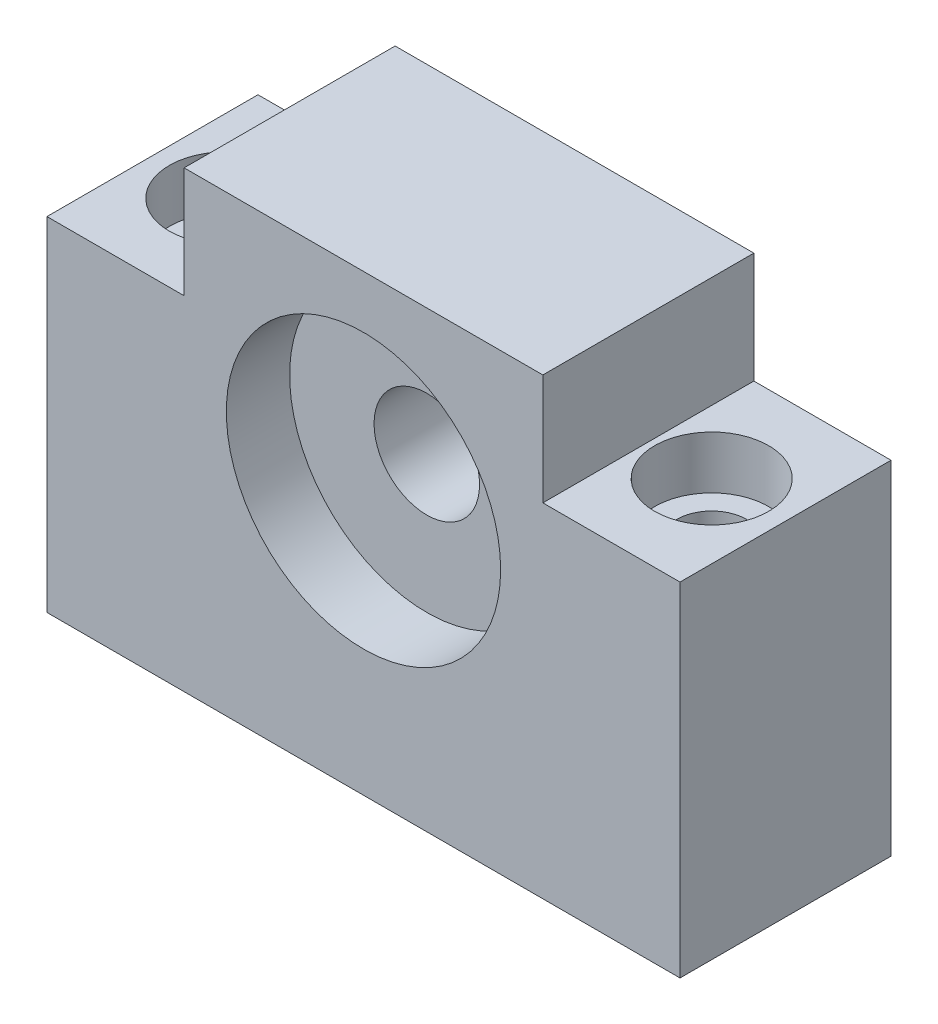
ISO-10303-21;
HEADER;
FILE_DESCRIPTION(('STEP AP214'),'2;1');
FILE_NAME('part.step','',(''),(''),'','','');
FILE_SCHEMA(('AUTOMOTIVE_DESIGN { 1 0 10303 214 1 1 1 1 }'));
ENDSEC;
DATA;
#1=APPLICATION_CONTEXT('core data for automotive mechanical design processes');
#2=APPLICATION_PROTOCOL_DEFINITION('international standard','automotive_design',2000,#1);
#3=PRODUCT_CONTEXT('',#1,'mechanical');
#4=PRODUCT('Part','Part','',(#3));
#5=PRODUCT_RELATED_PRODUCT_CATEGORY('part','',(#4));
#6=PRODUCT_DEFINITION_FORMATION('','',#4);
#7=PRODUCT_DEFINITION_CONTEXT('part definition',#1,'design');
#8=PRODUCT_DEFINITION('design','',#6,#7);
#9=PRODUCT_DEFINITION_SHAPE('','',#8);
#10=(LENGTH_UNIT() NAMED_UNIT(*) SI_UNIT(.MILLI.,.METRE.));
#11=(NAMED_UNIT(*) PLANE_ANGLE_UNIT() SI_UNIT($,.RADIAN.));
#12=(NAMED_UNIT(*) SI_UNIT($,.STERADIAN.) SOLID_ANGLE_UNIT());
#13=UNCERTAINTY_MEASURE_WITH_UNIT(LENGTH_MEASURE(1.E-05),#10,'distance_accuracy_value','');
#14=(GEOMETRIC_REPRESENTATION_CONTEXT(3) GLOBAL_UNCERTAINTY_ASSIGNED_CONTEXT((#13)) GLOBAL_UNIT_ASSIGNED_CONTEXT((#10,
#11,#12)) REPRESENTATION_CONTEXT('',''));
#15=CARTESIAN_POINT('',(0.,0.,0.));
#16=DIRECTION('',(0.,0.,1.));
#17=DIRECTION('',(1.,0.,0.));
#18=AXIS2_PLACEMENT_3D('',#15,#16,#17);
#19=CARTESIAN_POINT('',(2.13802587572613,11.0640732265446,20.));
#20=DIRECTION('',(0.,0.,-1.));
#21=DIRECTION('',(-1.,0.,0.));
#22=AXIS2_PLACEMENT_3D('',#19,#20,#21);
#23=CYLINDRICAL_SURFACE('',#22,5.);
#24=CARTESIAN_POINT('',(2.13802587572613,11.0640732265446,14.));
#25=DIRECTION('',(0.,0.,1.));
#26=DIRECTION('',(1.,0.,0.));
#27=AXIS2_PLACEMENT_3D('',#24,#25,#26);
#28=CIRCLE('',#27,5.);
#29=CARTESIAN_POINT('',(7.13802587572613,11.0640732265446,14.));
#30=VERTEX_POINT('',#29);
#31=EDGE_CURVE('E173',#30,#30,#28,.T.);
#32=ORIENTED_EDGE('',*,*,#31,.T.);
#33=EDGE_LOOP('',(#32));
#34=FACE_BOUND('',#33,.T.);
#35=CARTESIAN_POINT('',(2.13802587572613,11.0640732265446,6.));
#36=DIRECTION('',(0.,0.,-1.));
#37=DIRECTION('',(-1.,0.,0.));
#38=AXIS2_PLACEMENT_3D('',#35,#36,#37);
#39=CIRCLE('',#38,5.);
#40=CARTESIAN_POINT('',(-2.86197412427388,11.0640732265446,6.));
#41=VERTEX_POINT('',#40);
#42=EDGE_CURVE('E44',#41,#41,#39,.T.);
#43=ORIENTED_EDGE('',*,*,#42,.T.);
#44=EDGE_LOOP('',(#43));
#45=FACE_BOUND('',#44,.T.);
#46=ADVANCED_FACE('F40',(#34,#45),#23,.F.);
#47=CARTESIAN_POINT('',(-20.8619741242739,-13.9369267734554,9.99999999999999));
#48=DIRECTION('',(0.,1.,0.));
#49=DIRECTION('',(0.,0.,1.));
#50=AXIS2_PLACEMENT_3D('',#47,#48,#49);
#51=CYLINDRICAL_SURFACE('',#50,3.3);
#52=CARTESIAN_POINT('',(-20.8619741242739,-13.9359267734554,9.99999999999999));
#53=DIRECTION('',(0.,1.,0.));
#54=DIRECTION('',(0.,0.,1.));
#55=AXIS2_PLACEMENT_3D('',#52,#53,#54);
#56=CIRCLE('',#55,3.3);
#57=CARTESIAN_POINT('',(-20.8619741242739,-13.9359267734554,13.3));
#58=VERTEX_POINT('',#57);
#59=EDGE_CURVE('E172',#58,#58,#56,.F.);
#60=ORIENTED_EDGE('',*,*,#59,.T.);
#61=EDGE_LOOP('',(#60));
#62=FACE_BOUND('',#61,.T.);
#63=CARTESIAN_POINT('',(-20.8619741242739,13.5640732265446,9.99999999999999));
#64=DIRECTION('',(0.,1.,0.));
#65=DIRECTION('',(0.,0.,1.));
#66=AXIS2_PLACEMENT_3D('',#63,#64,#65);
#67=CIRCLE('',#66,3.3);
#68=CARTESIAN_POINT('',(-20.8619741242739,13.5640732265446,13.3));
#69=VERTEX_POINT('',#68);
#70=EDGE_CURVE('E169',#69,#69,#67,.F.);
#71=ORIENTED_EDGE('',*,*,#70,.F.);
#72=EDGE_LOOP('',(#71));
#73=FACE_BOUND('',#72,.T.);
#74=ADVANCED_FACE('F242',(#62,#73),#51,.F.);
#75=CARTESIAN_POINT('',(25.1380258757261,-13.9369267734554,9.99999999999999));
#76=DIRECTION('',(0.,1.,0.));
#77=DIRECTION('',(0.,0.,1.));
#78=AXIS2_PLACEMENT_3D('',#75,#76,#77);
#79=CYLINDRICAL_SURFACE('',#78,3.3);
#80=CARTESIAN_POINT('',(25.1380258757261,-13.9359267734554,9.99999999999999));
#81=DIRECTION('',(0.,1.,0.));
#82=DIRECTION('',(0.,0.,1.));
#83=AXIS2_PLACEMENT_3D('',#80,#81,#82);
#84=CIRCLE('',#83,3.3);
#85=CARTESIAN_POINT('',(25.1380258757261,-13.9359267734554,13.3));
#86=VERTEX_POINT('',#85);
#87=EDGE_CURVE('E143',#86,#86,#84,.F.);
#88=ORIENTED_EDGE('',*,*,#87,.T.);
#89=EDGE_LOOP('',(#88));
#90=FACE_BOUND('',#89,.T.);
#91=CARTESIAN_POINT('',(25.1380258757261,13.5640732265446,9.99999999999999));
#92=DIRECTION('',(0.,1.,0.));
#93=DIRECTION('',(0.,0.,1.));
#94=AXIS2_PLACEMENT_3D('',#91,#92,#93);
#95=CIRCLE('',#94,3.3);
#96=CARTESIAN_POINT('',(25.1380258757261,13.5640732265446,13.3));
#97=VERTEX_POINT('',#96);
#98=EDGE_CURVE('E166',#97,#97,#95,.F.);
#99=ORIENTED_EDGE('',*,*,#98,.F.);
#100=EDGE_LOOP('',(#99));
#101=FACE_BOUND('',#100,.T.);
#102=ADVANCED_FACE('F247',(#90,#101),#79,.F.);
#103=CARTESIAN_POINT('',(0.,0.,20.));
#104=DIRECTION('',(0.,0.,1.));
#105=DIRECTION('',(1.,0.,0.));
#106=AXIS2_PLACEMENT_3D('',#103,#104,#105);
#107=PLANE('',#106);
#108=CARTESIAN_POINT('',(2.13802587572613,11.0640732265446,20.));
#109=DIRECTION('',(0.,0.,1.));
#110=DIRECTION('',(1.,0.,0.));
#111=AXIS2_PLACEMENT_3D('',#108,#109,#110);
#112=CIRCLE('',#111,13.);
#113=CARTESIAN_POINT('',(15.1380258757261,11.0640732265446,20.));
#114=VERTEX_POINT('',#113);
#115=EDGE_CURVE('E183',#114,#114,#112,.T.);
#116=ORIENTED_EDGE('',*,*,#115,.F.);
#117=EDGE_LOOP('',(#116));
#118=FACE_BOUND('',#117,.T.);
#119=DIRECTION('',(0.,-1.,0.));
#120=VECTOR('',#119,1.);
#121=CARTESIAN_POINT('',(-27.8619741242739,18.5640732265446,20.));
#122=LINE('',#121,#120);
#123=CARTESIAN_POINT('',(-27.8619741242739,18.5640732265446,20.));
#124=VERTEX_POINT('',#123);
#125=CARTESIAN_POINT('',(-27.8619741242739,-13.9359267734554,20.));
#126=VERTEX_POINT('',#125);
#127=EDGE_CURVE('E154',#124,#126,#122,.T.);
#128=ORIENTED_EDGE('',*,*,#127,.T.);
#129=DIRECTION('',(1.,0.,0.));
#130=VECTOR('',#129,1.);
#131=CARTESIAN_POINT('',(-27.8619741242739,-13.9359267734554,20.));
#132=LINE('',#131,#130);
#133=CARTESIAN_POINT('',(32.1380258757261,-13.9359267734554,20.));
#134=VERTEX_POINT('',#133);
#135=EDGE_CURVE('E102',#126,#134,#132,.T.);
#136=ORIENTED_EDGE('',*,*,#135,.T.);
#137=DIRECTION('',(0.,1.,0.));
#138=VECTOR('',#137,1.);
#139=CARTESIAN_POINT('',(32.1380258757261,-13.9359267734554,20.));
#140=LINE('',#139,#138);
#141=CARTESIAN_POINT('',(32.1380258757261,18.5640732265446,20.));
#142=VERTEX_POINT('',#141);
#143=EDGE_CURVE('E206',#134,#142,#140,.T.);
#144=ORIENTED_EDGE('',*,*,#143,.T.);
#145=DIRECTION('',(-1.,0.,0.));
#146=VECTOR('',#145,1.);
#147=CARTESIAN_POINT('',(32.1380258757261,18.5640732265446,20.));
#148=LINE('',#147,#146);
#149=CARTESIAN_POINT('',(19.1380258757261,18.5640732265446,20.));
#150=VERTEX_POINT('',#149);
#151=EDGE_CURVE('E208',#142,#150,#148,.T.);
#152=ORIENTED_EDGE('',*,*,#151,.T.);
#153=DIRECTION('',(0.,1.,0.));
#154=VECTOR('',#153,1.);
#155=CARTESIAN_POINT('',(19.1380258757261,18.5640732265446,20.));
#156=LINE('',#155,#154);
#157=CARTESIAN_POINT('',(19.1380258757261,29.0640732265446,20.));
#158=VERTEX_POINT('',#157);
#159=EDGE_CURVE('E121',#150,#158,#156,.T.);
#160=ORIENTED_EDGE('',*,*,#159,.T.);
#161=DIRECTION('',(-1.,0.,0.));
#162=VECTOR('',#161,1.);
#163=CARTESIAN_POINT('',(19.1380258757261,29.0640732265446,20.));
#164=LINE('',#163,#162);
#165=CARTESIAN_POINT('',(-14.8619741242739,29.0640732265446,20.));
#166=VERTEX_POINT('',#165);
#167=EDGE_CURVE('E115',#158,#166,#164,.T.);
#168=ORIENTED_EDGE('',*,*,#167,.T.);
#169=DIRECTION('',(0.,-1.,0.));
#170=VECTOR('',#169,1.);
#171=CARTESIAN_POINT('',(-14.8619741242739,29.0640732265446,20.));
#172=LINE('',#171,#170);
#173=CARTESIAN_POINT('',(-14.8619741242739,18.5640732265446,20.));
#174=VERTEX_POINT('',#173);
#175=EDGE_CURVE('E119',#166,#174,#172,.T.);
#176=ORIENTED_EDGE('',*,*,#175,.T.);
#177=DIRECTION('',(-1.,0.,0.));
#178=VECTOR('',#177,1.);
#179=CARTESIAN_POINT('',(-14.8619741242739,18.5640732265446,20.));
#180=LINE('',#179,#178);
#181=EDGE_CURVE('E59',#174,#124,#180,.T.);
#182=ORIENTED_EDGE('',*,*,#181,.T.);
#183=EDGE_LOOP('',(#128,#136,#144,#152,#160,#168,#176,#182));
#184=FACE_BOUND('',#183,.T.);
#185=ADVANCED_FACE('F117',(#118,#184),#107,.T.);
#186=CARTESIAN_POINT('',(0.,0.,0.));
#187=DIRECTION('',(0.,0.,1.));
#188=DIRECTION('',(1.,0.,0.));
#189=AXIS2_PLACEMENT_3D('',#186,#187,#188);
#190=PLANE('',#189);
#191=CARTESIAN_POINT('',(2.13802587572613,11.0640732265446,0.));
#192=DIRECTION('',(0.,0.,-1.));
#193=DIRECTION('',(-1.,0.,0.));
#194=AXIS2_PLACEMENT_3D('',#191,#192,#193);
#195=CIRCLE('',#194,13.);
#196=CARTESIAN_POINT('',(-10.8619741242739,11.0640732265446,0.));
#197=VERTEX_POINT('',#196);
#198=EDGE_CURVE('E190',#197,#197,#195,.T.);
#199=ORIENTED_EDGE('',*,*,#198,.F.);
#200=EDGE_LOOP('',(#199));
#201=FACE_BOUND('',#200,.T.);
#202=DIRECTION('',(0.,-1.,0.));
#203=VECTOR('',#202,1.);
#204=CARTESIAN_POINT('',(-27.8619741242739,18.5640732265446,0.));
#205=LINE('',#204,#203);
#206=CARTESIAN_POINT('',(-27.8619741242739,18.5640732265446,0.));
#207=VERTEX_POINT('',#206);
#208=CARTESIAN_POINT('',(-27.8619741242739,-13.9359267734554,0.));
#209=VERTEX_POINT('',#208);
#210=EDGE_CURVE('E139',#207,#209,#205,.T.);
#211=ORIENTED_EDGE('',*,*,#210,.F.);
#212=DIRECTION('',(-1.,0.,0.));
#213=VECTOR('',#212,1.);
#214=CARTESIAN_POINT('',(-14.8619741242739,18.5640732265446,0.));
#215=LINE('',#214,#213);
#216=CARTESIAN_POINT('',(-14.8619741242739,18.5640732265446,0.));
#217=VERTEX_POINT('',#216);
#218=EDGE_CURVE('E94',#217,#207,#215,.T.);
#219=ORIENTED_EDGE('',*,*,#218,.F.);
#220=DIRECTION('',(0.,-1.,0.));
#221=VECTOR('',#220,1.);
#222=CARTESIAN_POINT('',(-14.8619741242739,29.0640732265446,0.));
#223=LINE('',#222,#221);
#224=CARTESIAN_POINT('',(-14.8619741242739,29.0640732265446,0.));
#225=VERTEX_POINT('',#224);
#226=EDGE_CURVE('E88',#225,#217,#223,.T.);
#227=ORIENTED_EDGE('',*,*,#226,.F.);
#228=DIRECTION('',(-1.,0.,0.));
#229=VECTOR('',#228,1.);
#230=CARTESIAN_POINT('',(19.1380258757261,29.0640732265446,0.));
#231=LINE('',#230,#229);
#232=CARTESIAN_POINT('',(19.1380258757261,29.0640732265446,0.));
#233=VERTEX_POINT('',#232);
#234=EDGE_CURVE('E129',#233,#225,#231,.T.);
#235=ORIENTED_EDGE('',*,*,#234,.F.);
#236=DIRECTION('',(0.,1.,0.));
#237=VECTOR('',#236,1.);
#238=CARTESIAN_POINT('',(19.1380258757261,18.5640732265446,0.));
#239=LINE('',#238,#237);
#240=CARTESIAN_POINT('',(19.1380258757261,18.5640732265446,0.));
#241=VERTEX_POINT('',#240);
#242=EDGE_CURVE('E149',#241,#233,#239,.T.);
#243=ORIENTED_EDGE('',*,*,#242,.F.);
#244=DIRECTION('',(-1.,0.,0.));
#245=VECTOR('',#244,1.);
#246=CARTESIAN_POINT('',(32.1380258757261,18.5640732265446,0.));
#247=LINE('',#246,#245);
#248=CARTESIAN_POINT('',(32.1380258757261,18.5640732265446,0.));
#249=VERTEX_POINT('',#248);
#250=EDGE_CURVE('E147',#249,#241,#247,.T.);
#251=ORIENTED_EDGE('',*,*,#250,.F.);
#252=DIRECTION('',(0.,1.,0.));
#253=VECTOR('',#252,1.);
#254=CARTESIAN_POINT('',(32.1380258757261,-13.9359267734554,0.));
#255=LINE('',#254,#253);
#256=CARTESIAN_POINT('',(32.1380258757261,-13.9359267734554,0.));
#257=VERTEX_POINT('',#256);
#258=EDGE_CURVE('E145',#257,#249,#255,.T.);
#259=ORIENTED_EDGE('',*,*,#258,.F.);
#260=DIRECTION('',(1.,0.,0.));
#261=VECTOR('',#260,1.);
#262=CARTESIAN_POINT('',(-27.8619741242739,-13.9359267734554,0.));
#263=LINE('',#262,#261);
#264=EDGE_CURVE('E142',#209,#257,#263,.T.);
#265=ORIENTED_EDGE('',*,*,#264,.F.);
#266=EDGE_LOOP('',(#211,#219,#227,#235,#243,#251,#259,#265));
#267=FACE_BOUND('',#266,.T.);
#268=ADVANCED_FACE('F221',(#201,#267),#190,.F.);
#269=CARTESIAN_POINT('',(-27.8619741242739,18.5640732265446,20.));
#270=DIRECTION('',(1.,0.,0.));
#271=DIRECTION('',(0.,0.,-1.));
#272=AXIS2_PLACEMENT_3D('',#269,#270,#271);
#273=PLANE('',#272);
#274=ORIENTED_EDGE('',*,*,#210,.T.);
#275=DIRECTION('',(0.,0.,-1.));
#276=VECTOR('',#275,1.);
#277=CARTESIAN_POINT('',(-27.8619741242739,-13.9359267734554,20.));
#278=LINE('',#277,#276);
#279=EDGE_CURVE('E11',#126,#209,#278,.T.);
#280=ORIENTED_EDGE('',*,*,#279,.F.);
#281=ORIENTED_EDGE('',*,*,#127,.F.);
#282=DIRECTION('',(0.,0.,-1.));
#283=VECTOR('',#282,1.);
#284=CARTESIAN_POINT('',(-27.8619741242739,18.5640732265446,20.));
#285=LINE('',#284,#283);
#286=EDGE_CURVE('E135',#124,#207,#285,.T.);
#287=ORIENTED_EDGE('',*,*,#286,.T.);
#288=EDGE_LOOP('',(#274,#280,#281,#287));
#289=FACE_BOUND('',#288,.T.);
#290=ADVANCED_FACE('F42',(#289),#273,.F.);
#291=CARTESIAN_POINT('',(-27.8619741242739,-13.9359267734554,20.));
#292=DIRECTION('',(0.,1.,0.));
#293=DIRECTION('',(0.,0.,1.));
#294=AXIS2_PLACEMENT_3D('',#291,#292,#293);
#295=PLANE('',#294);
#296=ORIENTED_EDGE('',*,*,#87,.F.);
#297=EDGE_LOOP('',(#296));
#298=FACE_BOUND('',#297,.T.);
#299=ORIENTED_EDGE('',*,*,#59,.F.);
#300=EDGE_LOOP('',(#299));
#301=FACE_BOUND('',#300,.T.);
#302=ORIENTED_EDGE('',*,*,#264,.T.);
#303=DIRECTION('',(0.,0.,-1.));
#304=VECTOR('',#303,1.);
#305=CARTESIAN_POINT('',(32.1380258757261,-13.9359267734554,20.));
#306=LINE('',#305,#304);
#307=EDGE_CURVE('E50',#134,#257,#306,.T.);
#308=ORIENTED_EDGE('',*,*,#307,.F.);
#309=ORIENTED_EDGE('',*,*,#135,.F.);
#310=ORIENTED_EDGE('',*,*,#279,.T.);
#311=EDGE_LOOP('',(#302,#308,#309,#310));
#312=FACE_BOUND('',#311,.T.);
#313=ADVANCED_FACE('F260',(#298,#301,#312),#295,.F.);
#314=CARTESIAN_POINT('',(32.1380258757261,-13.9359267734554,20.));
#315=DIRECTION('',(-1.,0.,0.));
#316=DIRECTION('',(0.,0.,1.));
#317=AXIS2_PLACEMENT_3D('',#314,#315,#316);
#318=PLANE('',#317);
#319=ORIENTED_EDGE('',*,*,#258,.T.);
#320=DIRECTION('',(0.,0.,-1.));
#321=VECTOR('',#320,1.);
#322=CARTESIAN_POINT('',(32.1380258757261,18.5640732265446,20.));
#323=LINE('',#322,#321);
#324=EDGE_CURVE('E161',#142,#249,#323,.T.);
#325=ORIENTED_EDGE('',*,*,#324,.F.);
#326=ORIENTED_EDGE('',*,*,#143,.F.);
#327=ORIENTED_EDGE('',*,*,#307,.T.);
#328=EDGE_LOOP('',(#319,#325,#326,#327));
#329=FACE_BOUND('',#328,.T.);
#330=ADVANCED_FACE('F310',(#329),#318,.F.);
#331=CARTESIAN_POINT('',(32.1380258757261,18.5640732265446,20.));
#332=DIRECTION('',(0.,-1.,0.));
#333=DIRECTION('',(0.,0.,-1.));
#334=AXIS2_PLACEMENT_3D('',#331,#332,#333);
#335=PLANE('',#334);
#336=CARTESIAN_POINT('',(25.1380258757261,18.5640732265446,9.99999999999999));
#337=DIRECTION('',(0.,1.,0.));
#338=DIRECTION('',(0.,0.,1.));
#339=AXIS2_PLACEMENT_3D('',#336,#337,#338);
#340=CIRCLE('',#339,5.4);
#341=CARTESIAN_POINT('',(25.1380258757261,18.5640732265446,15.4));
#342=VERTEX_POINT('',#341);
#343=EDGE_CURVE('E195',#342,#342,#340,.T.);
#344=ORIENTED_EDGE('',*,*,#343,.F.);
#345=EDGE_LOOP('',(#344));
#346=FACE_BOUND('',#345,.T.);
#347=ORIENTED_EDGE('',*,*,#250,.T.);
#348=DIRECTION('',(0.,0.,-1.));
#349=VECTOR('',#348,1.);
#350=CARTESIAN_POINT('',(19.1380258757261,18.5640732265446,20.));
#351=LINE('',#350,#349);
#352=EDGE_CURVE('E158',#150,#241,#351,.T.);
#353=ORIENTED_EDGE('',*,*,#352,.F.);
#354=ORIENTED_EDGE('',*,*,#151,.F.);
#355=ORIENTED_EDGE('',*,*,#324,.T.);
#356=EDGE_LOOP('',(#347,#353,#354,#355));
#357=FACE_BOUND('',#356,.T.);
#358=ADVANCED_FACE('F214',(#346,#357),#335,.F.);
#359=CARTESIAN_POINT('',(19.1380258757261,18.5640732265446,20.));
#360=DIRECTION('',(-1.,0.,0.));
#361=DIRECTION('',(0.,0.,1.));
#362=AXIS2_PLACEMENT_3D('',#359,#360,#361);
#363=PLANE('',#362);
#364=ORIENTED_EDGE('',*,*,#242,.T.);
#365=DIRECTION('',(0.,0.,-1.));
#366=VECTOR('',#365,1.);
#367=CARTESIAN_POINT('',(19.1380258757261,29.0640732265446,20.));
#368=LINE('',#367,#366);
#369=EDGE_CURVE('E130',#158,#233,#368,.T.);
#370=ORIENTED_EDGE('',*,*,#369,.F.);
#371=ORIENTED_EDGE('',*,*,#159,.F.);
#372=ORIENTED_EDGE('',*,*,#352,.T.);
#373=EDGE_LOOP('',(#364,#370,#371,#372));
#374=FACE_BOUND('',#373,.T.);
#375=ADVANCED_FACE('F218',(#374),#363,.F.);
#376=CARTESIAN_POINT('',(19.1380258757261,29.0640732265446,20.));
#377=DIRECTION('',(0.,-1.,0.));
#378=DIRECTION('',(0.,0.,-1.));
#379=AXIS2_PLACEMENT_3D('',#376,#377,#378);
#380=PLANE('',#379);
#381=ORIENTED_EDGE('',*,*,#234,.T.);
#382=DIRECTION('',(0.,0.,-1.));
#383=VECTOR('',#382,1.);
#384=CARTESIAN_POINT('',(-14.8619741242739,29.0640732265446,20.));
#385=LINE('',#384,#383);
#386=EDGE_CURVE('E126',#166,#225,#385,.T.);
#387=ORIENTED_EDGE('',*,*,#386,.F.);
#388=ORIENTED_EDGE('',*,*,#167,.F.);
#389=ORIENTED_EDGE('',*,*,#369,.T.);
#390=EDGE_LOOP('',(#381,#387,#388,#389));
#391=FACE_BOUND('',#390,.T.);
#392=ADVANCED_FACE('F127',(#391),#380,.F.);
#393=CARTESIAN_POINT('',(-14.8619741242739,29.0640732265446,20.));
#394=DIRECTION('',(1.,0.,0.));
#395=DIRECTION('',(0.,1.,0.));
#396=AXIS2_PLACEMENT_3D('',#393,#394,#395);
#397=PLANE('',#396);
#398=ORIENTED_EDGE('',*,*,#226,.T.);
#399=DIRECTION('',(0.,0.,-1.));
#400=VECTOR('',#399,1.);
#401=CARTESIAN_POINT('',(-14.8619741242739,18.5640732265446,20.));
#402=LINE('',#401,#400);
#403=EDGE_CURVE('E131',#174,#217,#402,.T.);
#404=ORIENTED_EDGE('',*,*,#403,.F.);
#405=ORIENTED_EDGE('',*,*,#175,.F.);
#406=ORIENTED_EDGE('',*,*,#386,.T.);
#407=EDGE_LOOP('',(#398,#404,#405,#406));
#408=FACE_BOUND('',#407,.T.);
#409=ADVANCED_FACE('F133',(#408),#397,.F.);
#410=CARTESIAN_POINT('',(-14.8619741242739,18.5640732265446,20.));
#411=DIRECTION('',(0.,-1.,0.));
#412=DIRECTION('',(0.,0.,-1.));
#413=AXIS2_PLACEMENT_3D('',#410,#411,#412);
#414=PLANE('',#413);
#415=CARTESIAN_POINT('',(-20.8619741242739,18.5640732265446,9.99999999999999));
#416=DIRECTION('',(0.,1.,0.));
#417=DIRECTION('',(0.,0.,1.));
#418=AXIS2_PLACEMENT_3D('',#415,#416,#417);
#419=CIRCLE('',#418,5.4);
#420=CARTESIAN_POINT('',(-20.8619741242739,18.5640732265446,15.4));
#421=VERTEX_POINT('',#420);
#422=EDGE_CURVE('E175',#421,#421,#419,.T.);
#423=ORIENTED_EDGE('',*,*,#422,.F.);
#424=EDGE_LOOP('',(#423));
#425=FACE_BOUND('',#424,.T.);
#426=ORIENTED_EDGE('',*,*,#218,.T.);
#427=ORIENTED_EDGE('',*,*,#286,.F.);
#428=ORIENTED_EDGE('',*,*,#181,.F.);
#429=ORIENTED_EDGE('',*,*,#403,.T.);
#430=EDGE_LOOP('',(#426,#427,#428,#429));
#431=FACE_BOUND('',#430,.T.);
#432=ADVANCED_FACE('F226',(#425,#431),#414,.F.);
#433=CARTESIAN_POINT('',(25.1380258757261,13.5640732265446,9.99999999999999));
#434=DIRECTION('',(0.,1.,0.));
#435=DIRECTION('',(0.,0.,1.));
#436=AXIS2_PLACEMENT_3D('',#433,#434,#435);
#437=PLANE('',#436);
#438=CARTESIAN_POINT('',(25.1380258757261,13.5640732265446,9.99999999999999));
#439=DIRECTION('',(0.,1.,0.));
#440=DIRECTION('',(0.,0.,1.));
#441=AXIS2_PLACEMENT_3D('',#438,#439,#440);
#442=CIRCLE('',#441,5.4);
#443=CARTESIAN_POINT('',(25.1380258757261,13.5640732265446,15.4));
#444=VERTEX_POINT('',#443);
#445=EDGE_CURVE('E170',#444,#444,#442,.T.);
#446=ORIENTED_EDGE('',*,*,#445,.T.);
#447=EDGE_LOOP('',(#446));
#448=FACE_BOUND('',#447,.T.);
#449=ORIENTED_EDGE('',*,*,#98,.T.);
#450=EDGE_LOOP('',(#449));
#451=FACE_BOUND('',#450,.T.);
#452=ADVANCED_FACE('F228',(#448,#451),#437,.T.);
#453=CARTESIAN_POINT('',(25.1380258757261,13.5640732265446,9.99999999999999));
#454=DIRECTION('',(0.,1.,0.));
#455=DIRECTION('',(0.,0.,1.));
#456=AXIS2_PLACEMENT_3D('',#453,#454,#455);
#457=CYLINDRICAL_SURFACE('',#456,5.4);
#458=ORIENTED_EDGE('',*,*,#445,.F.);
#459=EDGE_LOOP('',(#458));
#460=FACE_BOUND('',#459,.T.);
#461=ORIENTED_EDGE('',*,*,#343,.T.);
#462=EDGE_LOOP('',(#461));
#463=FACE_BOUND('',#462,.T.);
#464=ADVANCED_FACE('F235',(#460,#463),#457,.F.);
#465=CARTESIAN_POINT('',(-20.8619741242739,13.5640732265446,9.99999999999999));
#466=DIRECTION('',(0.,1.,0.));
#467=DIRECTION('',(0.,0.,1.));
#468=AXIS2_PLACEMENT_3D('',#465,#466,#467);
#469=PLANE('',#468);
#470=CARTESIAN_POINT('',(-20.8619741242739,13.5640732265446,9.99999999999999));
#471=DIRECTION('',(0.,1.,0.));
#472=DIRECTION('',(0.,0.,1.));
#473=AXIS2_PLACEMENT_3D('',#470,#471,#472);
#474=CIRCLE('',#473,5.4);
#475=CARTESIAN_POINT('',(-20.8619741242739,13.5640732265446,15.4));
#476=VERTEX_POINT('',#475);
#477=EDGE_CURVE('E180',#476,#476,#474,.T.);
#478=ORIENTED_EDGE('',*,*,#477,.T.);
#479=EDGE_LOOP('',(#478));
#480=FACE_BOUND('',#479,.T.);
#481=ORIENTED_EDGE('',*,*,#70,.T.);
#482=EDGE_LOOP('',(#481));
#483=FACE_BOUND('',#482,.T.);
#484=ADVANCED_FACE('F292',(#480,#483),#469,.T.);
#485=CARTESIAN_POINT('',(-20.8619741242739,13.5640732265446,9.99999999999999));
#486=DIRECTION('',(0.,1.,0.));
#487=DIRECTION('',(0.,0.,1.));
#488=AXIS2_PLACEMENT_3D('',#485,#486,#487);
#489=CYLINDRICAL_SURFACE('',#488,5.4);
#490=ORIENTED_EDGE('',*,*,#477,.F.);
#491=EDGE_LOOP('',(#490));
#492=FACE_BOUND('',#491,.T.);
#493=ORIENTED_EDGE('',*,*,#422,.T.);
#494=EDGE_LOOP('',(#493));
#495=FACE_BOUND('',#494,.T.);
#496=ADVANCED_FACE('F287',(#492,#495),#489,.F.);
#497=CARTESIAN_POINT('',(2.13802587572613,11.0640732265446,14.));
#498=DIRECTION('',(0.,0.,1.));
#499=DIRECTION('',(1.,0.,0.));
#500=AXIS2_PLACEMENT_3D('',#497,#498,#499);
#501=CYLINDRICAL_SURFACE('',#500,13.);
#502=CARTESIAN_POINT('',(2.13802587572613,11.0640732265446,14.));
#503=DIRECTION('',(0.,0.,1.));
#504=DIRECTION('',(1.,0.,0.));
#505=AXIS2_PLACEMENT_3D('',#502,#503,#504);
#506=CIRCLE('',#505,13.);
#507=CARTESIAN_POINT('',(15.1380258757261,11.0640732265446,14.));
#508=VERTEX_POINT('',#507);
#509=EDGE_CURVE('E176',#508,#508,#506,.T.);
#510=ORIENTED_EDGE('',*,*,#509,.F.);
#511=EDGE_LOOP('',(#510));
#512=FACE_BOUND('',#511,.T.);
#513=ORIENTED_EDGE('',*,*,#115,.T.);
#514=EDGE_LOOP('',(#513));
#515=FACE_BOUND('',#514,.T.);
#516=ADVANCED_FACE('F284',(#512,#515),#501,.F.);
#517=CARTESIAN_POINT('',(2.13802587572613,11.0640732265446,14.));
#518=DIRECTION('',(0.,0.,1.));
#519=DIRECTION('',(1.,0.,0.));
#520=AXIS2_PLACEMENT_3D('',#517,#518,#519);
#521=PLANE('',#520);
#522=ORIENTED_EDGE('',*,*,#31,.F.);
#523=EDGE_LOOP('',(#522));
#524=FACE_BOUND('',#523,.T.);
#525=ORIENTED_EDGE('',*,*,#509,.T.);
#526=EDGE_LOOP('',(#525));
#527=FACE_BOUND('',#526,.T.);
#528=ADVANCED_FACE('F278',(#524,#527),#521,.T.);
#529=CARTESIAN_POINT('',(2.13802587572613,11.0640732265446,6.));
#530=DIRECTION('',(0.,0.,-1.));
#531=DIRECTION('',(-1.,0.,0.));
#532=AXIS2_PLACEMENT_3D('',#529,#530,#531);
#533=CYLINDRICAL_SURFACE('',#532,13.);
#534=CARTESIAN_POINT('',(2.13802587572613,11.0640732265446,6.));
#535=DIRECTION('',(0.,0.,-1.));
#536=DIRECTION('',(-1.,0.,0.));
#537=AXIS2_PLACEMENT_3D('',#534,#535,#536);
#538=CIRCLE('',#537,13.);
#539=CARTESIAN_POINT('',(-10.8619741242739,11.0640732265446,6.));
#540=VERTEX_POINT('',#539);
#541=EDGE_CURVE('E264',#540,#540,#538,.T.);
#542=ORIENTED_EDGE('',*,*,#541,.F.);
#543=EDGE_LOOP('',(#542));
#544=FACE_BOUND('',#543,.T.);
#545=ORIENTED_EDGE('',*,*,#198,.T.);
#546=EDGE_LOOP('',(#545));
#547=FACE_BOUND('',#546,.T.);
#548=ADVANCED_FACE('F273',(#544,#547),#533,.F.);
#549=CARTESIAN_POINT('',(2.13802587572613,11.0640732265446,6.));
#550=DIRECTION('',(0.,0.,-1.));
#551=DIRECTION('',(-1.,0.,0.));
#552=AXIS2_PLACEMENT_3D('',#549,#550,#551);
#553=PLANE('',#552);
#554=ORIENTED_EDGE('',*,*,#42,.F.);
#555=EDGE_LOOP('',(#554));
#556=FACE_BOUND('',#555,.T.);
#557=ORIENTED_EDGE('',*,*,#541,.T.);
#558=EDGE_LOOP('',(#557));
#559=FACE_BOUND('',#558,.T.);
#560=ADVANCED_FACE('F271',(#556,#559),#553,.T.);
#561=CLOSED_SHELL('',(#46,#74,#102,#185,#268,#290,#313,#330,#358,#375,#392,#409,#432,#452,#464,
#484,#496,#516,#528,#548,#560));
#562=MANIFOLD_SOLID_BREP('B2',#561);
#563=ADVANCED_BREP_SHAPE_REPRESENTATION('',(#18,#562),#14);
#564=SHAPE_DEFINITION_REPRESENTATION(#9,#563);
ENDSEC;
END-ISO-10303-21;
